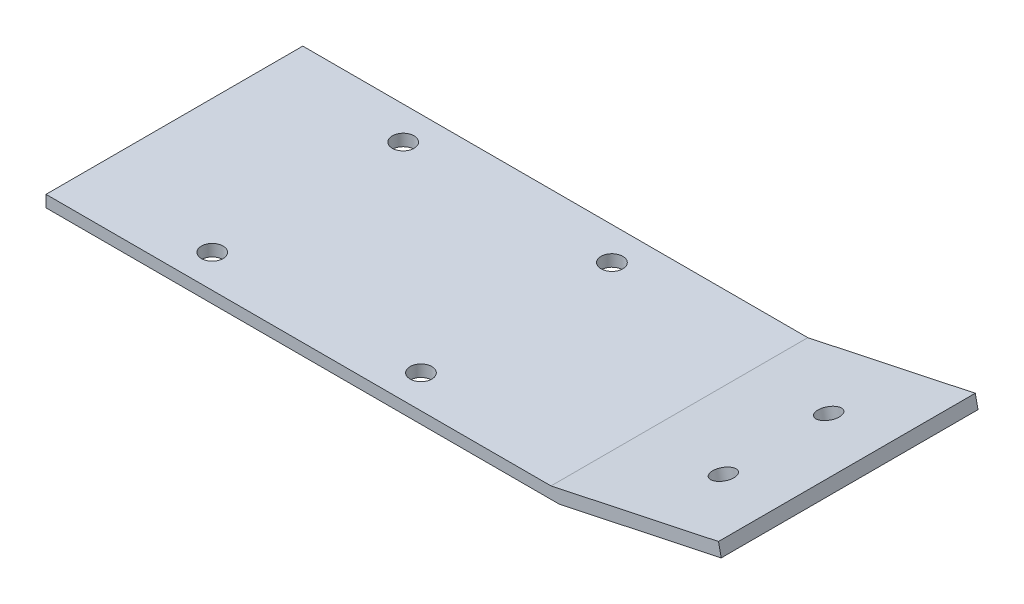
ISO-10303-21;
HEADER;
FILE_DESCRIPTION(('STEP AP214'),'2;1');
FILE_NAME('part.step','',(''),(''),'','','');
FILE_SCHEMA(('AUTOMOTIVE_DESIGN { 1 0 10303 214 1 1 1 1 }'));
ENDSEC;
DATA;
#1=APPLICATION_CONTEXT('core data for automotive mechanical design processes');
#2=APPLICATION_PROTOCOL_DEFINITION('international standard','automotive_design',2000,#1);
#3=PRODUCT_CONTEXT('',#1,'mechanical');
#4=PRODUCT('Part','Part','',(#3));
#5=PRODUCT_RELATED_PRODUCT_CATEGORY('part','',(#4));
#6=PRODUCT_DEFINITION_FORMATION('','',#4);
#7=PRODUCT_DEFINITION_CONTEXT('part definition',#1,'design');
#8=PRODUCT_DEFINITION('design','',#6,#7);
#9=PRODUCT_DEFINITION_SHAPE('','',#8);
#10=(LENGTH_UNIT() NAMED_UNIT(*) SI_UNIT(.MILLI.,.METRE.));
#11=(NAMED_UNIT(*) PLANE_ANGLE_UNIT() SI_UNIT($,.RADIAN.));
#12=(NAMED_UNIT(*) SI_UNIT($,.STERADIAN.) SOLID_ANGLE_UNIT());
#13=UNCERTAINTY_MEASURE_WITH_UNIT(LENGTH_MEASURE(1.E-05),#10,'distance_accuracy_value','');
#14=(GEOMETRIC_REPRESENTATION_CONTEXT(3) GLOBAL_UNCERTAINTY_ASSIGNED_CONTEXT((#13)) GLOBAL_UNIT_ASSIGNED_CONTEXT((#10,
#11,#12)) REPRESENTATION_CONTEXT('',''));
#15=CARTESIAN_POINT('',(0.,0.,0.));
#16=DIRECTION('',(0.,0.,1.));
#17=DIRECTION('',(1.,0.,0.));
#18=AXIS2_PLACEMENT_3D('',#15,#16,#17);
#19=CARTESIAN_POINT('',(0.,1.78096813429675,39.));
#20=DIRECTION('',(1.,0.,0.));
#21=DIRECTION('',(0.,1.,0.));
#22=AXIS2_PLACEMENT_3D('',#19,#20,#21);
#23=PLANE('',#22);
#24=DIRECTION('',(0.,-1.,0.));
#25=VECTOR('',#24,1.);
#26=CARTESIAN_POINT('',(0.,1.78096813429675,0.));
#27=LINE('',#26,#25);
#28=CARTESIAN_POINT('',(0.,1.78096813429675,0.));
#29=VERTEX_POINT('',#28);
#30=CARTESIAN_POINT('',(0.,0.,0.));
#31=VERTEX_POINT('',#30);
#32=EDGE_CURVE('E128',#29,#31,#27,.T.);
#33=ORIENTED_EDGE('',*,*,#32,.T.);
#34=DIRECTION('',(0.,0.,-1.));
#35=VECTOR('',#34,1.);
#36=CARTESIAN_POINT('',(0.,0.,39.));
#37=LINE('',#36,#35);
#38=CARTESIAN_POINT('',(0.,0.,39.));
#39=VERTEX_POINT('',#38);
#40=EDGE_CURVE('E11',#39,#31,#37,.T.);
#41=ORIENTED_EDGE('',*,*,#40,.F.);
#42=DIRECTION('',(0.,-1.,0.));
#43=VECTOR('',#42,1.);
#44=CARTESIAN_POINT('',(0.,1.78096813429675,39.));
#45=LINE('',#44,#43);
#46=CARTESIAN_POINT('',(0.,1.78096813429675,39.));
#47=VERTEX_POINT('',#46);
#48=EDGE_CURVE('E145',#47,#39,#45,.T.);
#49=ORIENTED_EDGE('',*,*,#48,.F.);
#50=DIRECTION('',(0.,0.,-1.));
#51=VECTOR('',#50,1.);
#52=CARTESIAN_POINT('',(0.,1.78096813429675,39.));
#53=LINE('',#52,#51);
#54=EDGE_CURVE('E124',#47,#29,#53,.T.);
#55=ORIENTED_EDGE('',*,*,#54,.T.);
#56=EDGE_LOOP('',(#33,#41,#49,#55));
#57=FACE_BOUND('',#56,.T.);
#58=ADVANCED_FACE('F38',(#57),#23,.F.);
#59=CARTESIAN_POINT('',(0.,0.,39.));
#60=DIRECTION('',(0.,1.,0.));
#61=DIRECTION('',(0.,0.,1.));
#62=AXIS2_PLACEMENT_3D('',#59,#60,#61);
#63=PLANE('',#62);
#64=CARTESIAN_POINT('',(20.25,0.,34.));
#65=DIRECTION('',(0.,1.,0.));
#66=DIRECTION('',(0.,0.,1.));
#67=AXIS2_PLACEMENT_3D('',#64,#65,#66);
#68=CIRCLE('',#67,1.65);
#69=CARTESIAN_POINT('',(20.25,0.,35.65));
#70=VERTEX_POINT('',#69);
#71=EDGE_CURVE('E327',#70,#70,#68,.T.);
#72=ORIENTED_EDGE('',*,*,#71,.T.);
#73=EDGE_LOOP('',(#72));
#74=FACE_BOUND('',#73,.T.);
#75=CARTESIAN_POINT('',(51.95,0.,34.));
#76=DIRECTION('',(0.,1.,0.));
#77=DIRECTION('',(0.,0.,1.));
#78=AXIS2_PLACEMENT_3D('',#75,#76,#77);
#79=CIRCLE('',#78,1.65);
#80=CARTESIAN_POINT('',(51.95,0.,35.65));
#81=VERTEX_POINT('',#80);
#82=EDGE_CURVE('E330',#81,#81,#79,.T.);
#83=ORIENTED_EDGE('',*,*,#82,.T.);
#84=EDGE_LOOP('',(#83));
#85=FACE_BOUND('',#84,.T.);
#86=CARTESIAN_POINT('',(51.95,0.,5.));
#87=DIRECTION('',(0.,1.,0.));
#88=DIRECTION('',(0.,0.,1.));
#89=AXIS2_PLACEMENT_3D('',#86,#87,#88);
#90=CIRCLE('',#89,1.65);
#91=CARTESIAN_POINT('',(51.95,0.,6.65));
#92=VERTEX_POINT('',#91);
#93=EDGE_CURVE('E339',#92,#92,#90,.T.);
#94=ORIENTED_EDGE('',*,*,#93,.T.);
#95=EDGE_LOOP('',(#94));
#96=FACE_BOUND('',#95,.T.);
#97=CARTESIAN_POINT('',(20.25,0.,5.));
#98=DIRECTION('',(0.,1.,0.));
#99=DIRECTION('',(0.,0.,1.));
#100=AXIS2_PLACEMENT_3D('',#97,#98,#99);
#101=CIRCLE('',#100,1.65);
#102=CARTESIAN_POINT('',(20.25,0.,6.65));
#103=VERTEX_POINT('',#102);
#104=EDGE_CURVE('E382',#103,#103,#101,.T.);
#105=ORIENTED_EDGE('',*,*,#104,.T.);
#106=EDGE_LOOP('',(#105));
#107=FACE_BOUND('',#106,.T.);
#108=DIRECTION('',(1.,0.,0.));
#109=VECTOR('',#108,1.);
#110=CARTESIAN_POINT('',(0.,0.,0.));
#111=LINE('',#110,#109);
#112=CARTESIAN_POINT('',(77.9406723808541,0.,0.));
#113=VERTEX_POINT('',#112);
#114=EDGE_CURVE('E132',#31,#113,#111,.T.);
#115=ORIENTED_EDGE('',*,*,#114,.T.);
#116=DIRECTION('',(0.,0.,-1.));
#117=VECTOR('',#116,1.);
#118=CARTESIAN_POINT('',(77.9406723808541,0.,39.));
#119=LINE('',#118,#117);
#120=CARTESIAN_POINT('',(77.9406723808541,0.,39.));
#121=VERTEX_POINT('',#120);
#122=EDGE_CURVE('E47',#121,#113,#119,.T.);
#123=ORIENTED_EDGE('',*,*,#122,.F.);
#124=DIRECTION('',(1.,0.,0.));
#125=VECTOR('',#124,1.);
#126=CARTESIAN_POINT('',(0.,0.,39.));
#127=LINE('',#126,#125);
#128=EDGE_CURVE('E92',#39,#121,#127,.T.);
#129=ORIENTED_EDGE('',*,*,#128,.F.);
#130=ORIENTED_EDGE('',*,*,#40,.T.);
#131=EDGE_LOOP('',(#115,#123,#129,#130));
#132=FACE_BOUND('',#131,.T.);
#133=ADVANCED_FACE('F178',(#74,#85,#96,#107,#132),#63,.F.);
#134=CARTESIAN_POINT('',(77.9406723808541,0.,39.));
#135=DIRECTION('',(-0.207911690817761,0.978147600733805,0.));
#136=DIRECTION('',(-0.978147600733805,-0.207911690817761,0.));
#137=AXIS2_PLACEMENT_3D('',#134,#135,#136);
#138=PLANE('',#137);
#139=CARTESIAN_POINT('',(91.7880373926427,2.94334829509556,11.5));
#140=DIRECTION('',(-0.207911690817761,0.978147600733805,0.));
#141=DIRECTION('',(-0.978147600733805,-0.207911690817761,0.));
#142=AXIS2_PLACEMENT_3D('',#139,#140,#141);
#143=CIRCLE('',#142,1.65);
#144=CARTESIAN_POINT('',(90.1740938514319,2.60029400524626,11.5));
#145=VERTEX_POINT('',#144);
#146=EDGE_CURVE('E133',#145,#145,#143,.T.);
#147=ORIENTED_EDGE('',*,*,#146,.T.);
#148=EDGE_LOOP('',(#147));
#149=FACE_BOUND('',#148,.T.);
#150=CARTESIAN_POINT('',(91.7880373926426,2.94334829509556,27.5));
#151=DIRECTION('',(-0.207911690817761,0.978147600733805,0.));
#152=DIRECTION('',(-0.978147600733805,-0.207911690817761,0.));
#153=AXIS2_PLACEMENT_3D('',#150,#151,#152);
#154=CIRCLE('',#153,1.65);
#155=CARTESIAN_POINT('',(90.1740938514318,2.60029400524626,27.5));
#156=VERTEX_POINT('',#155);
#157=EDGE_CURVE('E345',#156,#156,#154,.T.);
#158=ORIENTED_EDGE('',*,*,#157,.T.);
#159=EDGE_LOOP('',(#158));
#160=FACE_BOUND('',#159,.T.);
#161=DIRECTION('',(0.978147600733805,0.207911690817761,0.));
#162=VECTOR('',#161,1.);
#163=CARTESIAN_POINT('',(77.9406723808541,0.,0.));
#164=LINE('',#163,#162);
#165=CARTESIAN_POINT('',(102.547661000714,5.23037689409093,0.));
#166=VERTEX_POINT('',#165);
#167=EDGE_CURVE('E136',#113,#166,#164,.T.);
#168=ORIENTED_EDGE('',*,*,#167,.T.);
#169=DIRECTION('',(0.,0.,-1.));
#170=VECTOR('',#169,1.);
#171=CARTESIAN_POINT('',(102.547661000714,5.23037689409093,39.));
#172=LINE('',#171,#170);
#173=CARTESIAN_POINT('',(102.547661000714,5.23037689409093,39.));
#174=VERTEX_POINT('',#173);
#175=EDGE_CURVE('E116',#174,#166,#172,.T.);
#176=ORIENTED_EDGE('',*,*,#175,.F.);
#177=DIRECTION('',(0.978147600733805,0.207911690817761,0.));
#178=VECTOR('',#177,1.);
#179=CARTESIAN_POINT('',(77.9406723808541,0.,39.));
#180=LINE('',#179,#178);
#181=EDGE_CURVE('E105',#121,#174,#180,.T.);
#182=ORIENTED_EDGE('',*,*,#181,.F.);
#183=ORIENTED_EDGE('',*,*,#122,.T.);
#184=EDGE_LOOP('',(#168,#176,#182,#183));
#185=FACE_BOUND('',#184,.T.);
#186=ADVANCED_FACE('F156',(#149,#160,#185),#138,.F.);
#187=CARTESIAN_POINT('',(102.547661000714,5.23037689409093,39.));
#188=DIRECTION('',(-0.978147600733805,-0.207911690817762,0.));
#189=DIRECTION('',(0.207911690817762,-0.978147600733805,0.));
#190=AXIS2_PLACEMENT_3D('',#187,#188,#189);
#191=PLANE('',#190);
#192=DIRECTION('',(-0.207911690817762,0.978147600733805,0.));
#193=VECTOR('',#192,1.);
#194=CARTESIAN_POINT('',(102.547661000714,5.23037689409093,0.));
#195=LINE('',#194,#193);
#196=CARTESIAN_POINT('',(102.131837619079,7.18667209555854,0.));
#197=VERTEX_POINT('',#196);
#198=EDGE_CURVE('E114',#166,#197,#195,.T.);
#199=ORIENTED_EDGE('',*,*,#198,.T.);
#200=DIRECTION('',(0.,0.,-1.));
#201=VECTOR('',#200,1.);
#202=CARTESIAN_POINT('',(102.131837619079,7.18667209555854,39.));
#203=LINE('',#202,#201);
#204=CARTESIAN_POINT('',(102.131837619079,7.18667209555854,39.));
#205=VERTEX_POINT('',#204);
#206=EDGE_CURVE('E111',#205,#197,#203,.T.);
#207=ORIENTED_EDGE('',*,*,#206,.F.);
#208=DIRECTION('',(-0.207911690817762,0.978147600733805,0.));
#209=VECTOR('',#208,1.);
#210=CARTESIAN_POINT('',(102.547661000714,5.23037689409093,39.));
#211=LINE('',#210,#209);
#212=EDGE_CURVE('E99',#174,#205,#211,.T.);
#213=ORIENTED_EDGE('',*,*,#212,.F.);
#214=ORIENTED_EDGE('',*,*,#175,.T.);
#215=EDGE_LOOP('',(#199,#207,#213,#214));
#216=FACE_BOUND('',#215,.T.);
#217=ADVANCED_FACE('F112',(#216),#191,.F.);
#218=CARTESIAN_POINT('',(102.131837619079,7.18667209555854,39.));
#219=DIRECTION('',(0.207911690817761,-0.978147600733805,0.));
#220=DIRECTION('',(0.978147600733805,0.207911690817761,0.));
#221=AXIS2_PLACEMENT_3D('',#218,#219,#220);
#222=PLANE('',#221);
#223=CARTESIAN_POINT('',(91.3722140110071,4.89964349656319,11.5));
#224=DIRECTION('',(-0.207911690817761,0.978147600733805,0.));
#225=DIRECTION('',(-0.978147600733805,-0.207911690817761,0.));
#226=AXIS2_PLACEMENT_3D('',#223,#224,#225);
#227=CIRCLE('',#226,1.65);
#228=CARTESIAN_POINT('',(89.7582704697963,4.55658920671388,11.5));
#229=VERTEX_POINT('',#228);
#230=EDGE_CURVE('E336',#229,#229,#227,.T.);
#231=ORIENTED_EDGE('',*,*,#230,.F.);
#232=EDGE_LOOP('',(#231));
#233=FACE_BOUND('',#232,.T.);
#234=CARTESIAN_POINT('',(91.3722140110071,4.89964349656318,27.5));
#235=DIRECTION('',(-0.207911690817761,0.978147600733805,0.));
#236=DIRECTION('',(-0.978147600733805,-0.207911690817761,0.));
#237=AXIS2_PLACEMENT_3D('',#234,#235,#236);
#238=CIRCLE('',#237,1.65);
#239=CARTESIAN_POINT('',(89.7582704697963,4.55658920671388,27.5));
#240=VERTEX_POINT('',#239);
#241=EDGE_CURVE('E329',#240,#240,#238,.T.);
#242=ORIENTED_EDGE('',*,*,#241,.F.);
#243=EDGE_LOOP('',(#242));
#244=FACE_BOUND('',#243,.T.);
#245=DIRECTION('',(-0.978147600733805,-0.207911690817761,0.));
#246=VECTOR('',#245,1.);
#247=CARTESIAN_POINT('',(102.131837619079,7.18667209555854,0.));
#248=LINE('',#247,#246);
#249=CARTESIAN_POINT('',(76.7,1.78096813429676,0.));
#250=VERTEX_POINT('',#249);
#251=EDGE_CURVE('E78',#197,#250,#248,.T.);
#252=ORIENTED_EDGE('',*,*,#251,.T.);
#253=DIRECTION('',(0.,0.,-1.));
#254=VECTOR('',#253,1.);
#255=CARTESIAN_POINT('',(76.7,1.78096813429676,39.));
#256=LINE('',#255,#254);
#257=CARTESIAN_POINT('',(76.7,1.78096813429676,39.));
#258=VERTEX_POINT('',#257);
#259=EDGE_CURVE('E117',#258,#250,#256,.T.);
#260=ORIENTED_EDGE('',*,*,#259,.F.);
#261=DIRECTION('',(-0.978147600733805,-0.207911690817761,0.));
#262=VECTOR('',#261,1.);
#263=CARTESIAN_POINT('',(102.131837619079,7.18667209555854,39.));
#264=LINE('',#263,#262);
#265=EDGE_CURVE('E103',#205,#258,#264,.T.);
#266=ORIENTED_EDGE('',*,*,#265,.F.);
#267=ORIENTED_EDGE('',*,*,#206,.T.);
#268=EDGE_LOOP('',(#252,#260,#266,#267));
#269=FACE_BOUND('',#268,.T.);
#270=ADVANCED_FACE('F119',(#233,#244,#269),#222,.F.);
#271=CARTESIAN_POINT('',(76.7,1.78096813429676,39.));
#272=DIRECTION('',(0.,-1.,0.));
#273=DIRECTION('',(1.,0.,0.));
#274=AXIS2_PLACEMENT_3D('',#271,#272,#273);
#275=PLANE('',#274);
#276=CARTESIAN_POINT('',(20.25,1.78096813429675,34.));
#277=DIRECTION('',(0.,1.,0.));
#278=DIRECTION('',(1.,0.,0.));
#279=AXIS2_PLACEMENT_3D('',#276,#277,#278);
#280=CIRCLE('',#279,1.65);
#281=CARTESIAN_POINT('',(21.9,1.78096813429675,34.));
#282=VERTEX_POINT('',#281);
#283=EDGE_CURVE('E325',#282,#282,#280,.T.);
#284=ORIENTED_EDGE('',*,*,#283,.F.);
#285=EDGE_LOOP('',(#284));
#286=FACE_BOUND('',#285,.T.);
#287=CARTESIAN_POINT('',(51.95,1.78096813429675,34.));
#288=DIRECTION('',(0.,1.,0.));
#289=DIRECTION('',(1.,0.,0.));
#290=AXIS2_PLACEMENT_3D('',#287,#288,#289);
#291=CIRCLE('',#290,1.65);
#292=CARTESIAN_POINT('',(53.6,1.78096813429675,34.));
#293=VERTEX_POINT('',#292);
#294=EDGE_CURVE('E393',#293,#293,#291,.T.);
#295=ORIENTED_EDGE('',*,*,#294,.F.);
#296=EDGE_LOOP('',(#295));
#297=FACE_BOUND('',#296,.T.);
#298=CARTESIAN_POINT('',(51.95,1.78096813429675,5.));
#299=DIRECTION('',(0.,1.,0.));
#300=DIRECTION('',(-1.,0.,0.));
#301=AXIS2_PLACEMENT_3D('',#298,#299,#300);
#302=CIRCLE('',#301,1.65);
#303=CARTESIAN_POINT('',(50.3,1.78096813429675,5.));
#304=VERTEX_POINT('',#303);
#305=EDGE_CURVE('E390',#304,#304,#302,.T.);
#306=ORIENTED_EDGE('',*,*,#305,.F.);
#307=EDGE_LOOP('',(#306));
#308=FACE_BOUND('',#307,.T.);
#309=CARTESIAN_POINT('',(20.25,1.78096813429675,5.));
#310=DIRECTION('',(0.,1.,0.));
#311=DIRECTION('',(-1.,0.,0.));
#312=AXIS2_PLACEMENT_3D('',#309,#310,#311);
#313=CIRCLE('',#312,1.65);
#314=CARTESIAN_POINT('',(18.6,1.78096813429675,5.));
#315=VERTEX_POINT('',#314);
#316=EDGE_CURVE('E386',#315,#315,#313,.T.);
#317=ORIENTED_EDGE('',*,*,#316,.F.);
#318=EDGE_LOOP('',(#317));
#319=FACE_BOUND('',#318,.T.);
#320=DIRECTION('',(-1.,0.,0.));
#321=VECTOR('',#320,1.);
#322=CARTESIAN_POINT('',(76.7,1.78096813429676,0.));
#323=LINE('',#322,#321);
#324=EDGE_CURVE('E84',#250,#29,#323,.T.);
#325=ORIENTED_EDGE('',*,*,#324,.T.);
#326=ORIENTED_EDGE('',*,*,#54,.F.);
#327=DIRECTION('',(-1.,0.,0.));
#328=VECTOR('',#327,1.);
#329=CARTESIAN_POINT('',(76.7,1.78096813429676,39.));
#330=LINE('',#329,#328);
#331=EDGE_CURVE('E55',#258,#47,#330,.T.);
#332=ORIENTED_EDGE('',*,*,#331,.F.);
#333=ORIENTED_EDGE('',*,*,#259,.T.);
#334=EDGE_LOOP('',(#325,#326,#332,#333));
#335=FACE_BOUND('',#334,.T.);
#336=ADVANCED_FACE('F163',(#286,#297,#308,#319,#335),#275,.F.);
#337=CARTESIAN_POINT('',(0.,0.,39.));
#338=DIRECTION('',(0.,0.,1.));
#339=DIRECTION('',(1.,0.,0.));
#340=AXIS2_PLACEMENT_3D('',#337,#338,#339);
#341=PLANE('',#340);
#342=ORIENTED_EDGE('',*,*,#48,.T.);
#343=ORIENTED_EDGE('',*,*,#128,.T.);
#344=ORIENTED_EDGE('',*,*,#181,.T.);
#345=ORIENTED_EDGE('',*,*,#212,.T.);
#346=ORIENTED_EDGE('',*,*,#265,.T.);
#347=ORIENTED_EDGE('',*,*,#331,.T.);
#348=EDGE_LOOP('',(#342,#343,#344,#345,#346,#347));
#349=FACE_BOUND('',#348,.T.);
#350=ADVANCED_FACE('F101',(#349),#341,.T.);
#351=CARTESIAN_POINT('',(0.,0.,0.));
#352=DIRECTION('',(0.,0.,1.));
#353=DIRECTION('',(1.,0.,0.));
#354=AXIS2_PLACEMENT_3D('',#351,#352,#353);
#355=PLANE('',#354);
#356=ORIENTED_EDGE('',*,*,#32,.F.);
#357=ORIENTED_EDGE('',*,*,#324,.F.);
#358=ORIENTED_EDGE('',*,*,#251,.F.);
#359=ORIENTED_EDGE('',*,*,#198,.F.);
#360=ORIENTED_EDGE('',*,*,#167,.F.);
#361=ORIENTED_EDGE('',*,*,#114,.F.);
#362=EDGE_LOOP('',(#356,#357,#358,#359,#360,#361));
#363=FACE_BOUND('',#362,.T.);
#364=ADVANCED_FACE('F159',(#363),#355,.F.);
#365=CARTESIAN_POINT('',(93.4513309191847,-4.88183251077487,27.5));
#366=DIRECTION('',(-0.207911690817761,0.978147600733805,0.));
#367=DIRECTION('',(-0.978147600733805,-0.207911690817761,0.));
#368=AXIS2_PLACEMENT_3D('',#365,#366,#367);
#369=CYLINDRICAL_SURFACE('',#368,1.65);
#370=ORIENTED_EDGE('',*,*,#241,.T.);
#371=EDGE_LOOP('',(#370));
#372=FACE_BOUND('',#371,.T.);
#373=ORIENTED_EDGE('',*,*,#157,.F.);
#374=EDGE_LOOP('',(#373));
#375=FACE_BOUND('',#374,.T.);
#376=ADVANCED_FACE('F223',(#372,#375),#369,.F.);
#377=CARTESIAN_POINT('',(93.4513309191847,-4.88183251077487,11.5));
#378=DIRECTION('',(-0.207911690817761,0.978147600733805,0.));
#379=DIRECTION('',(-0.978147600733805,-0.207911690817761,0.));
#380=AXIS2_PLACEMENT_3D('',#377,#378,#379);
#381=CYLINDRICAL_SURFACE('',#380,1.65);
#382=ORIENTED_EDGE('',*,*,#230,.T.);
#383=EDGE_LOOP('',(#382));
#384=FACE_BOUND('',#383,.T.);
#385=ORIENTED_EDGE('',*,*,#146,.F.);
#386=EDGE_LOOP('',(#385));
#387=FACE_BOUND('',#386,.T.);
#388=ADVANCED_FACE('F230',(#384,#387),#381,.F.);
#389=CARTESIAN_POINT('',(20.25,-8.21903186570325,5.));
#390=DIRECTION('',(0.,1.,0.));
#391=DIRECTION('',(-1.,0.,0.));
#392=AXIS2_PLACEMENT_3D('',#389,#390,#391);
#393=CYLINDRICAL_SURFACE('',#392,1.65);
#394=ORIENTED_EDGE('',*,*,#316,.T.);
#395=EDGE_LOOP('',(#394));
#396=FACE_BOUND('',#395,.T.);
#397=ORIENTED_EDGE('',*,*,#104,.F.);
#398=EDGE_LOOP('',(#397));
#399=FACE_BOUND('',#398,.T.);
#400=ADVANCED_FACE('F240',(#396,#399),#393,.F.);
#401=CARTESIAN_POINT('',(51.95,-8.21903186570325,5.));
#402=DIRECTION('',(0.,1.,0.));
#403=DIRECTION('',(-1.,0.,0.));
#404=AXIS2_PLACEMENT_3D('',#401,#402,#403);
#405=CYLINDRICAL_SURFACE('',#404,1.65);
#406=ORIENTED_EDGE('',*,*,#305,.T.);
#407=EDGE_LOOP('',(#406));
#408=FACE_BOUND('',#407,.T.);
#409=ORIENTED_EDGE('',*,*,#93,.F.);
#410=EDGE_LOOP('',(#409));
#411=FACE_BOUND('',#410,.T.);
#412=ADVANCED_FACE('F249',(#408,#411),#405,.F.);
#413=CARTESIAN_POINT('',(51.95,-8.21903186570325,34.));
#414=DIRECTION('',(0.,1.,0.));
#415=DIRECTION('',(-1.,0.,0.));
#416=AXIS2_PLACEMENT_3D('',#413,#414,#415);
#417=CYLINDRICAL_SURFACE('',#416,1.65);
#418=ORIENTED_EDGE('',*,*,#294,.T.);
#419=EDGE_LOOP('',(#418));
#420=FACE_BOUND('',#419,.T.);
#421=ORIENTED_EDGE('',*,*,#82,.F.);
#422=EDGE_LOOP('',(#421));
#423=FACE_BOUND('',#422,.T.);
#424=ADVANCED_FACE('F259',(#420,#423),#417,.F.);
#425=CARTESIAN_POINT('',(20.25,-8.21903186570325,34.));
#426=DIRECTION('',(0.,1.,0.));
#427=DIRECTION('',(-1.,0.,0.));
#428=AXIS2_PLACEMENT_3D('',#425,#426,#427);
#429=CYLINDRICAL_SURFACE('',#428,1.65);
#430=ORIENTED_EDGE('',*,*,#283,.T.);
#431=EDGE_LOOP('',(#430));
#432=FACE_BOUND('',#431,.T.);
#433=ORIENTED_EDGE('',*,*,#71,.F.);
#434=EDGE_LOOP('',(#433));
#435=FACE_BOUND('',#434,.T.);
#436=ADVANCED_FACE('F269',(#432,#435),#429,.F.);
#437=CLOSED_SHELL('',(#58,#133,#186,#217,#270,#336,#350,#364,#376,#388,#400,#412,#424,#436));
#438=MANIFOLD_SOLID_BREP('B2',#437);
#439=ADVANCED_BREP_SHAPE_REPRESENTATION('',(#18,#438),#14);
#440=SHAPE_DEFINITION_REPRESENTATION(#9,#439);
ENDSEC;
END-ISO-10303-21;
